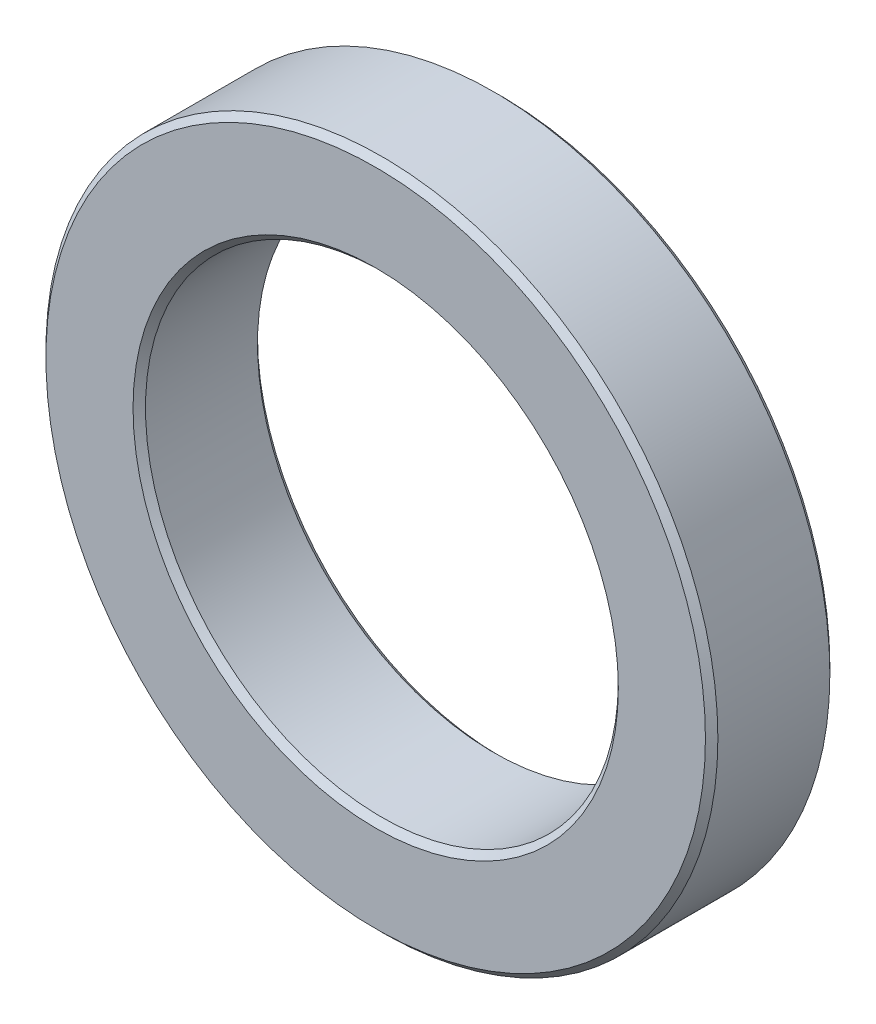
ISO-10303-21;
HEADER;
FILE_DESCRIPTION(('STEP AP214'),'2;1');
FILE_NAME('part.step','',(''),(''),'','','');
FILE_SCHEMA(('AUTOMOTIVE_DESIGN { 1 0 10303 214 1 1 1 1 }'));
ENDSEC;
DATA;
#1=APPLICATION_CONTEXT('core data for automotive mechanical design processes');
#2=APPLICATION_PROTOCOL_DEFINITION('international standard','automotive_design',2000,#1);
#3=PRODUCT_CONTEXT('',#1,'mechanical');
#4=PRODUCT('Part','Part','',(#3));
#5=PRODUCT_RELATED_PRODUCT_CATEGORY('part','',(#4));
#6=PRODUCT_DEFINITION_FORMATION('','',#4);
#7=PRODUCT_DEFINITION_CONTEXT('part definition',#1,'design');
#8=PRODUCT_DEFINITION('design','',#6,#7);
#9=PRODUCT_DEFINITION_SHAPE('','',#8);
#10=(LENGTH_UNIT() NAMED_UNIT(*) SI_UNIT(.MILLI.,.METRE.));
#11=(NAMED_UNIT(*) PLANE_ANGLE_UNIT() SI_UNIT($,.RADIAN.));
#12=(NAMED_UNIT(*) SI_UNIT($,.STERADIAN.) SOLID_ANGLE_UNIT());
#13=UNCERTAINTY_MEASURE_WITH_UNIT(LENGTH_MEASURE(1.E-05),#10,'distance_accuracy_value','');
#14=(GEOMETRIC_REPRESENTATION_CONTEXT(3) GLOBAL_UNCERTAINTY_ASSIGNED_CONTEXT((#13)) GLOBAL_UNIT_ASSIGNED_CONTEXT((#10,
#11,#12)) REPRESENTATION_CONTEXT('',''));
#15=CARTESIAN_POINT('',(0.,0.,0.));
#16=DIRECTION('',(0.,0.,1.));
#17=DIRECTION('',(1.,0.,0.));
#18=AXIS2_PLACEMENT_3D('',#15,#16,#17);
#19=CARTESIAN_POINT('',(0.,0.,5.));
#20=DIRECTION('',(0.,0.,1.));
#21=DIRECTION('',(1.,0.,0.));
#22=AXIS2_PLACEMENT_3D('',#19,#20,#21);
#23=PLANE('',#22);
#24=CARTESIAN_POINT('',(0.,0.,5.));
#25=DIRECTION('',(0.,0.,1.));
#26=DIRECTION('',(1.,0.,0.));
#27=AXIS2_PLACEMENT_3D('',#24,#25,#26);
#28=CIRCLE('',#27,26.5);
#29=CARTESIAN_POINT('',(26.5,0.,5.));
#30=VERTEX_POINT('',#29);
#31=EDGE_CURVE('E10',#30,#30,#28,.T.);
#32=ORIENTED_EDGE('',*,*,#31,.T.);
#33=EDGE_LOOP('',(#32));
#34=FACE_BOUND('',#33,.T.);
#35=CARTESIAN_POINT('',(0.,0.,5.));
#36=DIRECTION('',(0.,0.,1.));
#37=DIRECTION('',(1.,0.,0.));
#38=AXIS2_PLACEMENT_3D('',#35,#36,#37);
#39=CIRCLE('',#38,19.5);
#40=CARTESIAN_POINT('',(19.5,0.,5.));
#41=VERTEX_POINT('',#40);
#42=EDGE_CURVE('E45',#41,#41,#39,.F.);
#43=ORIENTED_EDGE('',*,*,#42,.T.);
#44=EDGE_LOOP('',(#43));
#45=FACE_BOUND('',#44,.T.);
#46=ADVANCED_FACE('F37',(#34,#45),#23,.T.);
#47=CARTESIAN_POINT('',(0.,0.,-5.));
#48=DIRECTION('',(0.,0.,1.));
#49=DIRECTION('',(1.,0.,0.));
#50=AXIS2_PLACEMENT_3D('',#47,#48,#49);
#51=PLANE('',#50);
#52=CARTESIAN_POINT('',(0.,0.,-5.));
#53=DIRECTION('',(0.,0.,1.));
#54=DIRECTION('',(1.,0.,0.));
#55=AXIS2_PLACEMENT_3D('',#52,#53,#54);
#56=CIRCLE('',#55,19.5);
#57=CARTESIAN_POINT('',(19.5,0.,-5.));
#58=VERTEX_POINT('',#57);
#59=EDGE_CURVE('E64',#58,#58,#56,.T.);
#60=ORIENTED_EDGE('',*,*,#59,.T.);
#61=EDGE_LOOP('',(#60));
#62=FACE_BOUND('',#61,.T.);
#63=CARTESIAN_POINT('',(0.,0.,-5.));
#64=DIRECTION('',(0.,0.,1.));
#65=DIRECTION('',(1.,0.,0.));
#66=AXIS2_PLACEMENT_3D('',#63,#64,#65);
#67=CIRCLE('',#66,26.5);
#68=CARTESIAN_POINT('',(26.5,0.,-5.));
#69=VERTEX_POINT('',#68);
#70=EDGE_CURVE('E67',#69,#69,#67,.F.);
#71=ORIENTED_EDGE('',*,*,#70,.T.);
#72=EDGE_LOOP('',(#71));
#73=FACE_BOUND('',#72,.T.);
#74=ADVANCED_FACE('F71',(#62,#73),#51,.F.);
#75=CARTESIAN_POINT('',(0.,0.,5.));
#76=DIRECTION('',(0.,0.,-1.));
#77=DIRECTION('',(-1.,0.,0.));
#78=AXIS2_PLACEMENT_3D('',#75,#76,#77);
#79=CYLINDRICAL_SURFACE('',#78,27.);
#80=CARTESIAN_POINT('',(0.,0.,-4.5));
#81=DIRECTION('',(0.,0.,1.));
#82=DIRECTION('',(1.,0.,0.));
#83=AXIS2_PLACEMENT_3D('',#80,#81,#82);
#84=CIRCLE('',#83,27.);
#85=CARTESIAN_POINT('',(27.,0.,-4.5));
#86=VERTEX_POINT('',#85);
#87=EDGE_CURVE('E49',#86,#86,#84,.T.);
#88=ORIENTED_EDGE('',*,*,#87,.T.);
#89=EDGE_LOOP('',(#88));
#90=FACE_BOUND('',#89,.T.);
#91=CARTESIAN_POINT('',(0.,0.,4.49999999999999));
#92=DIRECTION('',(0.,0.,1.));
#93=DIRECTION('',(1.,0.,0.));
#94=AXIS2_PLACEMENT_3D('',#91,#92,#93);
#95=CIRCLE('',#94,27.);
#96=CARTESIAN_POINT('',(27.,0.,4.49999999999999));
#97=VERTEX_POINT('',#96);
#98=EDGE_CURVE('E53',#97,#97,#95,.F.);
#99=ORIENTED_EDGE('',*,*,#98,.T.);
#100=EDGE_LOOP('',(#99));
#101=FACE_BOUND('',#100,.T.);
#102=ADVANCED_FACE('F81',(#90,#101),#79,.T.);
#103=CARTESIAN_POINT('',(0.,0.,5.));
#104=DIRECTION('',(0.,0.,-1.));
#105=DIRECTION('',(-1.,0.,0.));
#106=AXIS2_PLACEMENT_3D('',#103,#104,#105);
#107=CYLINDRICAL_SURFACE('',#106,19.);
#108=CARTESIAN_POINT('',(0.,0.,-4.49999999999999));
#109=DIRECTION('',(0.,0.,1.));
#110=DIRECTION('',(1.,0.,0.));
#111=AXIS2_PLACEMENT_3D('',#108,#109,#110);
#112=CIRCLE('',#111,19.);
#113=CARTESIAN_POINT('',(19.,0.,-4.49999999999999));
#114=VERTEX_POINT('',#113);
#115=EDGE_CURVE('E58',#114,#114,#112,.F.);
#116=ORIENTED_EDGE('',*,*,#115,.T.);
#117=EDGE_LOOP('',(#116));
#118=FACE_BOUND('',#117,.T.);
#119=CARTESIAN_POINT('',(0.,0.,4.49999999999999));
#120=DIRECTION('',(0.,0.,1.));
#121=DIRECTION('',(1.,0.,0.));
#122=AXIS2_PLACEMENT_3D('',#119,#120,#121);
#123=CIRCLE('',#122,19.);
#124=CARTESIAN_POINT('',(19.,0.,4.49999999999999));
#125=VERTEX_POINT('',#124);
#126=EDGE_CURVE('E61',#125,#125,#123,.T.);
#127=ORIENTED_EDGE('',*,*,#126,.T.);
#128=EDGE_LOOP('',(#127));
#129=FACE_BOUND('',#128,.T.);
#130=ADVANCED_FACE('F84',(#118,#129),#107,.F.);
#131=CARTESIAN_POINT('',(0.,0.,-5.));
#132=DIRECTION('',(0.,0.,-1.));
#133=DIRECTION('',(-1.,0.,0.));
#134=AXIS2_PLACEMENT_3D('',#131,#132,#133);
#135=CONICAL_SURFACE('',#134,19.5,0.785398163397445);
#136=ORIENTED_EDGE('',*,*,#115,.F.);
#137=EDGE_LOOP('',(#136));
#138=FACE_BOUND('',#137,.T.);
#139=ORIENTED_EDGE('',*,*,#59,.F.);
#140=EDGE_LOOP('',(#139));
#141=FACE_BOUND('',#140,.T.);
#142=ADVANCED_FACE('F77',(#138,#141),#135,.F.);
#143=CARTESIAN_POINT('',(0.,0.,-4.5));
#144=DIRECTION('',(0.,0.,1.));
#145=DIRECTION('',(1.,0.,0.));
#146=AXIS2_PLACEMENT_3D('',#143,#144,#145);
#147=CONICAL_SURFACE('',#146,27.,0.785398163397448);
#148=ORIENTED_EDGE('',*,*,#70,.F.);
#149=EDGE_LOOP('',(#148));
#150=FACE_BOUND('',#149,.T.);
#151=ORIENTED_EDGE('',*,*,#87,.F.);
#152=EDGE_LOOP('',(#151));
#153=FACE_BOUND('',#152,.T.);
#154=ADVANCED_FACE('F73',(#150,#153),#147,.T.);
#155=CARTESIAN_POINT('',(0.,0.,5.));
#156=DIRECTION('',(0.,0.,-1.));
#157=DIRECTION('',(-1.,0.,0.));
#158=AXIS2_PLACEMENT_3D('',#155,#156,#157);
#159=CONICAL_SURFACE('',#158,26.5,0.785398163397448);
#160=ORIENTED_EDGE('',*,*,#98,.F.);
#161=EDGE_LOOP('',(#160));
#162=FACE_BOUND('',#161,.T.);
#163=ORIENTED_EDGE('',*,*,#31,.F.);
#164=EDGE_LOOP('',(#163));
#165=FACE_BOUND('',#164,.T.);
#166=ADVANCED_FACE('F76',(#162,#165),#159,.T.);
#167=CARTESIAN_POINT('',(0.,0.,4.49999999999999));
#168=DIRECTION('',(0.,0.,1.));
#169=DIRECTION('',(1.,0.,0.));
#170=AXIS2_PLACEMENT_3D('',#167,#168,#169);
#171=CONICAL_SURFACE('',#170,19.,0.785398163397445);
#172=ORIENTED_EDGE('',*,*,#42,.F.);
#173=EDGE_LOOP('',(#172));
#174=FACE_BOUND('',#173,.T.);
#175=ORIENTED_EDGE('',*,*,#126,.F.);
#176=EDGE_LOOP('',(#175));
#177=FACE_BOUND('',#176,.T.);
#178=ADVANCED_FACE('F40',(#174,#177),#171,.F.);
#179=CLOSED_SHELL('',(#46,#74,#102,#130,#142,#154,#166,#178));
#180=MANIFOLD_SOLID_BREP('B2',#179);
#181=ADVANCED_BREP_SHAPE_REPRESENTATION('',(#18,#180),#14);
#182=SHAPE_DEFINITION_REPRESENTATION(#9,#181);
ENDSEC;
END-ISO-10303-21;
